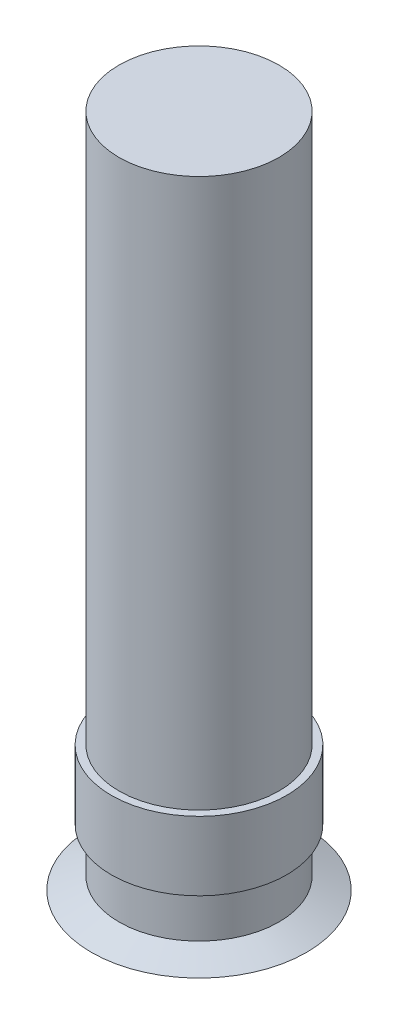
ISO-10303-21;
HEADER;
FILE_DESCRIPTION(('STEP AP214'),'2;1');
FILE_NAME('part.step','',(''),(''),'','','');
FILE_SCHEMA(('AUTOMOTIVE_DESIGN { 1 0 10303 214 1 1 1 1 }'));
ENDSEC;
DATA;
#1=APPLICATION_CONTEXT('core data for automotive mechanical design processes');
#2=APPLICATION_PROTOCOL_DEFINITION('international standard','automotive_design',2000,#1);
#3=PRODUCT_CONTEXT('',#1,'mechanical');
#4=PRODUCT('Part','Part','',(#3));
#5=PRODUCT_RELATED_PRODUCT_CATEGORY('part','',(#4));
#6=PRODUCT_DEFINITION_FORMATION('','',#4);
#7=PRODUCT_DEFINITION_CONTEXT('part definition',#1,'design');
#8=PRODUCT_DEFINITION('design','',#6,#7);
#9=PRODUCT_DEFINITION_SHAPE('','',#8);
#10=(LENGTH_UNIT() NAMED_UNIT(*) SI_UNIT(.MILLI.,.METRE.));
#11=(NAMED_UNIT(*) PLANE_ANGLE_UNIT() SI_UNIT($,.RADIAN.));
#12=(NAMED_UNIT(*) SI_UNIT($,.STERADIAN.) SOLID_ANGLE_UNIT());
#13=UNCERTAINTY_MEASURE_WITH_UNIT(LENGTH_MEASURE(1.E-05),#10,'distance_accuracy_value','');
#14=(GEOMETRIC_REPRESENTATION_CONTEXT(3) GLOBAL_UNCERTAINTY_ASSIGNED_CONTEXT((#13)) GLOBAL_UNIT_ASSIGNED_CONTEXT((#10,
#11,#12)) REPRESENTATION_CONTEXT('',''));
#15=CARTESIAN_POINT('',(0.,0.,0.));
#16=DIRECTION('',(0.,0.,1.));
#17=DIRECTION('',(1.,0.,0.));
#18=AXIS2_PLACEMENT_3D('',#15,#16,#17);
#19=CARTESIAN_POINT('',(-1.5127726465226,23.8032159257355,0.));
#20=DIRECTION('',(0.,1.,0.));
#21=DIRECTION('',(0.,0.,1.));
#22=AXIS2_PLACEMENT_3D('',#19,#20,#21);
#23=PLANE('',#22);
#24=CARTESIAN_POINT('',(4.0434773534774,23.8032159257355,0.));
#25=DIRECTION('',(0.,1.,0.));
#26=DIRECTION('',(0.,0.,1.));
#27=AXIS2_PLACEMENT_3D('',#24,#25,#26);
#28=CIRCLE('',#27,5.55625);
#29=CARTESIAN_POINT('',(4.0434773534774,23.8032159257355,5.55625));
#30=VERTEX_POINT('',#29);
#31=EDGE_CURVE('E40',#30,#30,#28,.T.);
#32=ORIENTED_EDGE('',*,*,#31,.T.);
#33=EDGE_LOOP('',(#32));
#34=FACE_BOUND('',#33,.T.);
#35=ADVANCED_FACE('F15',(#34),#23,.T.);
#36=CARTESIAN_POINT('',(-3.4328435428436,-23.0399236624433,0.));
#37=DIRECTION('',(0.,-1.,0.));
#38=DIRECTION('',(0.,0.,-1.));
#39=AXIS2_PLACEMENT_3D('',#36,#37,#38);
#40=PLANE('',#39);
#41=CARTESIAN_POINT('',(4.0434773534774,-23.0399236624433,0.));
#42=DIRECTION('',(0.,1.,0.));
#43=DIRECTION('',(0.,0.,1.));
#44=AXIS2_PLACEMENT_3D('',#41,#42,#43);
#45=CIRCLE('',#44,7.476320896321);
#46=CARTESIAN_POINT('',(4.0434773534774,-23.0399236624433,7.476320896321));
#47=VERTEX_POINT('',#46);
#48=EDGE_CURVE('E10',#47,#47,#45,.T.);
#49=ORIENTED_EDGE('',*,*,#48,.F.);
#50=EDGE_LOOP('',(#49));
#51=FACE_BOUND('',#50,.T.);
#52=ADVANCED_FACE('F59',(#51),#40,.T.);
#53=CARTESIAN_POINT('',(4.0434773534774,-22.1752124791323,0.));
#54=DIRECTION('',(0.,-1.,0.));
#55=DIRECTION('',(0.,0.,-1.));
#56=AXIS2_PLACEMENT_3D('',#53,#54,#55);
#57=CONICAL_SURFACE('',#56,5.55625,1.14764823704886);
#58=ORIENTED_EDGE('',*,*,#48,.T.);
#59=EDGE_LOOP('',(#58));
#60=FACE_BOUND('',#59,.T.);
#61=CARTESIAN_POINT('',(4.0434773534774,-22.1752124791323,0.));
#62=DIRECTION('',(0.,1.,0.));
#63=DIRECTION('',(0.,0.,1.));
#64=AXIS2_PLACEMENT_3D('',#61,#62,#63);
#65=CIRCLE('',#64,5.55625);
#66=CARTESIAN_POINT('',(4.0434773534774,-22.1752124791323,5.55625));
#67=VERTEX_POINT('',#66);
#68=EDGE_CURVE('E21',#67,#67,#65,.T.);
#69=ORIENTED_EDGE('',*,*,#68,.F.);
#70=EDGE_LOOP('',(#69));
#71=FACE_BOUND('',#70,.T.);
#72=ADVANCED_FACE('F64',(#60,#71),#57,.T.);
#73=CARTESIAN_POINT('',(4.0434773534774,23.8032159257355,0.));
#74=DIRECTION('',(0.,1.,0.));
#75=DIRECTION('',(0.,0.,1.));
#76=AXIS2_PLACEMENT_3D('',#73,#74,#75);
#77=CYLINDRICAL_SURFACE('',#76,5.55625);
#78=ORIENTED_EDGE('',*,*,#68,.T.);
#79=EDGE_LOOP('',(#78));
#80=FACE_BOUND('',#79,.T.);
#81=CARTESIAN_POINT('',(4.0434773534774,-19.0764124791323,0.));
#82=DIRECTION('',(0.,1.,0.));
#83=DIRECTION('',(0.,0.,1.));
#84=AXIS2_PLACEMENT_3D('',#81,#82,#83);
#85=CIRCLE('',#84,5.55625);
#86=CARTESIAN_POINT('',(4.0434773534774,-19.0764124791323,5.55625));
#87=VERTEX_POINT('',#86);
#88=EDGE_CURVE('E25',#87,#87,#85,.T.);
#89=ORIENTED_EDGE('',*,*,#88,.F.);
#90=EDGE_LOOP('',(#89));
#91=FACE_BOUND('',#90,.T.);
#92=ADVANCED_FACE('F70',(#80,#91),#77,.T.);
#93=CARTESIAN_POINT('',(-1.5127726465226,-19.0764124791323,0.));
#94=DIRECTION('',(0.,-1.,0.));
#95=DIRECTION('',(0.,0.,-1.));
#96=AXIS2_PLACEMENT_3D('',#93,#94,#95);
#97=PLANE('',#96);
#98=ORIENTED_EDGE('',*,*,#88,.T.);
#99=EDGE_LOOP('',(#98));
#100=FACE_BOUND('',#99,.T.);
#101=CARTESIAN_POINT('',(4.0434773534774,-19.0764124791323,0.));
#102=DIRECTION('',(0.,1.,0.));
#103=DIRECTION('',(0.,0.,1.));
#104=AXIS2_PLACEMENT_3D('',#101,#102,#103);
#105=CIRCLE('',#104,6.08557642298468);
#106=CARTESIAN_POINT('',(4.0434773534774,-19.0764124791323,6.08557642298468));
#107=VERTEX_POINT('',#106);
#108=EDGE_CURVE('E29',#107,#107,#105,.T.);
#109=ORIENTED_EDGE('',*,*,#108,.F.);
#110=EDGE_LOOP('',(#109));
#111=FACE_BOUND('',#110,.T.);
#112=ADVANCED_FACE('F75',(#100,#111),#97,.T.);
#113=CARTESIAN_POINT('',(4.0434773534774,23.8032159257355,0.));
#114=DIRECTION('',(0.,1.,0.));
#115=DIRECTION('',(0.,0.,1.));
#116=AXIS2_PLACEMENT_3D('',#113,#114,#115);
#117=CYLINDRICAL_SURFACE('',#116,6.08557642298468);
#118=ORIENTED_EDGE('',*,*,#108,.T.);
#119=EDGE_LOOP('',(#118));
#120=FACE_BOUND('',#119,.T.);
#121=CARTESIAN_POINT('',(4.0434773534774,-14.2967840742645,0.));
#122=DIRECTION('',(0.,1.,0.));
#123=DIRECTION('',(0.,0.,1.));
#124=AXIS2_PLACEMENT_3D('',#121,#122,#123);
#125=CIRCLE('',#124,6.08557642298468);
#126=CARTESIAN_POINT('',(4.0434773534774,-14.2967840742645,6.08557642298468));
#127=VERTEX_POINT('',#126);
#128=EDGE_CURVE('E34',#127,#127,#125,.T.);
#129=ORIENTED_EDGE('',*,*,#128,.F.);
#130=EDGE_LOOP('',(#129));
#131=FACE_BOUND('',#130,.T.);
#132=ADVANCED_FACE('F55',(#120,#131),#117,.T.);
#133=CARTESIAN_POINT('',(-2.04209906950728,-14.2967840742645,0.));
#134=DIRECTION('',(0.,1.,0.));
#135=DIRECTION('',(0.,0.,1.));
#136=AXIS2_PLACEMENT_3D('',#133,#134,#135);
#137=PLANE('',#136);
#138=ORIENTED_EDGE('',*,*,#128,.T.);
#139=EDGE_LOOP('',(#138));
#140=FACE_BOUND('',#139,.T.);
#141=CARTESIAN_POINT('',(4.0434773534774,-14.2967840742645,0.));
#142=DIRECTION('',(0.,1.,0.));
#143=DIRECTION('',(0.,0.,1.));
#144=AXIS2_PLACEMENT_3D('',#141,#142,#143);
#145=CIRCLE('',#144,5.55625);
#146=CARTESIAN_POINT('',(4.0434773534774,-14.2967840742645,5.55625));
#147=VERTEX_POINT('',#146);
#148=EDGE_CURVE('E37',#147,#147,#145,.T.);
#149=ORIENTED_EDGE('',*,*,#148,.F.);
#150=EDGE_LOOP('',(#149));
#151=FACE_BOUND('',#150,.T.);
#152=ADVANCED_FACE('F47',(#140,#151),#137,.T.);
#153=CARTESIAN_POINT('',(4.0434773534774,23.8032159257355,0.));
#154=DIRECTION('',(0.,1.,0.));
#155=DIRECTION('',(0.,0.,1.));
#156=AXIS2_PLACEMENT_3D('',#153,#154,#155);
#157=CYLINDRICAL_SURFACE('',#156,5.55625);
#158=ORIENTED_EDGE('',*,*,#148,.T.);
#159=EDGE_LOOP('',(#158));
#160=FACE_BOUND('',#159,.T.);
#161=ORIENTED_EDGE('',*,*,#31,.F.);
#162=EDGE_LOOP('',(#161));
#163=FACE_BOUND('',#162,.T.);
#164=ADVANCED_FACE('F45',(#160,#163),#157,.T.);
#165=CLOSED_SHELL('',(#35,#52,#72,#92,#112,#132,#152,#164));
#166=MANIFOLD_SOLID_BREP('B1',#165);
#167=ADVANCED_BREP_SHAPE_REPRESENTATION('',(#18,#166),#14);
#168=SHAPE_DEFINITION_REPRESENTATION(#9,#167);
ENDSEC;
END-ISO-10303-21;
